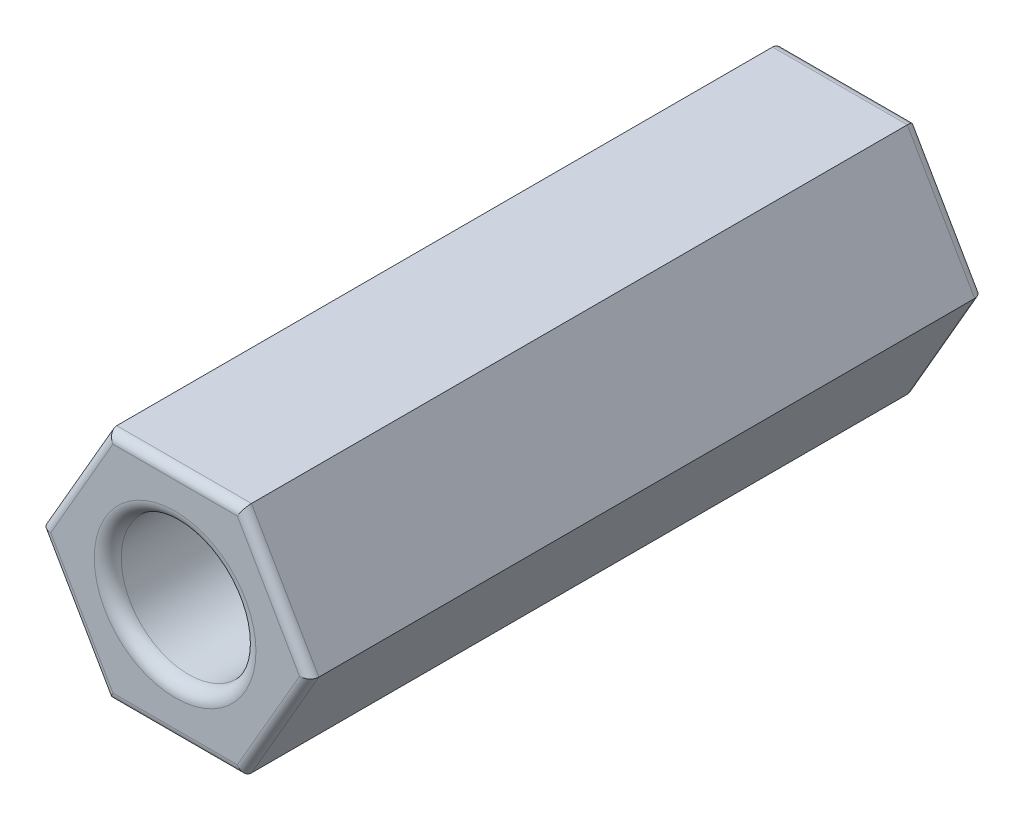
ISO-10303-21;
HEADER;
FILE_DESCRIPTION(('STEP AP214'),'2;1');
FILE_NAME('part.step','',(''),(''),'','','');
FILE_SCHEMA(('AUTOMOTIVE_DESIGN { 1 0 10303 214 1 1 1 1 }'));
ENDSEC;
DATA;
#1=APPLICATION_CONTEXT('core data for automotive mechanical design processes');
#2=APPLICATION_PROTOCOL_DEFINITION('international standard','automotive_design',2000,#1);
#3=PRODUCT_CONTEXT('',#1,'mechanical');
#4=PRODUCT('Part','Part','',(#3));
#5=PRODUCT_RELATED_PRODUCT_CATEGORY('part','',(#4));
#6=PRODUCT_DEFINITION_FORMATION('','',#4);
#7=PRODUCT_DEFINITION_CONTEXT('part definition',#1,'design');
#8=PRODUCT_DEFINITION('design','',#6,#7);
#9=PRODUCT_DEFINITION_SHAPE('','',#8);
#10=(LENGTH_UNIT() NAMED_UNIT(*) SI_UNIT(.MILLI.,.METRE.));
#11=(NAMED_UNIT(*) PLANE_ANGLE_UNIT() SI_UNIT($,.RADIAN.));
#12=(NAMED_UNIT(*) SI_UNIT($,.STERADIAN.) SOLID_ANGLE_UNIT());
#13=UNCERTAINTY_MEASURE_WITH_UNIT(LENGTH_MEASURE(1.E-05),#10,'distance_accuracy_value','');
#14=(GEOMETRIC_REPRESENTATION_CONTEXT(3) GLOBAL_UNCERTAINTY_ASSIGNED_CONTEXT((#13)) GLOBAL_UNIT_ASSIGNED_CONTEXT((#10,
#11,#12)) REPRESENTATION_CONTEXT('',''));
#15=CARTESIAN_POINT('',(0.,0.,0.));
#16=DIRECTION('',(0.,0.,1.));
#17=DIRECTION('',(1.,0.,0.));
#18=AXIS2_PLACEMENT_3D('',#15,#16,#17);
#19=CARTESIAN_POINT('',(0.,0.,15.));
#20=DIRECTION('',(0.,0.,1.));
#21=DIRECTION('',(1.,0.,0.));
#22=AXIS2_PLACEMENT_3D('',#19,#20,#21);
#23=PLANE('',#22);
#24=DIRECTION('',(-1.,0.,0.));
#25=VECTOR('',#24,1.);
#26=CARTESIAN_POINT('',(-1.50000000000001,2.39807621135331,15.));
#27=LINE('',#26,#25);
#28=CARTESIAN_POINT('',(1.38452994616207,2.39807621135332,15.));
#29=VERTEX_POINT('',#28);
#30=CARTESIAN_POINT('',(-1.38452994616209,2.39807621135331,15.));
#31=VERTEX_POINT('',#30);
#32=EDGE_CURVE('E127',#29,#31,#27,.T.);
#33=ORIENTED_EDGE('',*,*,#32,.T.);
#34=DIRECTION('',(-0.499999999999995,-0.866025403784442,0.));
#35=VECTOR('',#34,1.);
#36=CARTESIAN_POINT('',(-2.82679491924311,-0.10000000000002,15.));
#37=LINE('',#36,#35);
#38=CARTESIAN_POINT('',(-2.76905989232415,0.,15.));
#39=VERTEX_POINT('',#38);
#40=EDGE_CURVE('E160',#31,#39,#37,.T.);
#41=ORIENTED_EDGE('',*,*,#40,.T.);
#42=DIRECTION('',(0.500000000000007,-0.866025403784435,0.));
#43=VECTOR('',#42,1.);
#44=CARTESIAN_POINT('',(-1.32679491924309,-2.49807621135333,15.));
#45=LINE('',#44,#43);
#46=CARTESIAN_POINT('',(-1.38452994616205,-2.39807621135333,15.));
#47=VERTEX_POINT('',#46);
#48=EDGE_CURVE('E158',#39,#47,#45,.T.);
#49=ORIENTED_EDGE('',*,*,#48,.T.);
#50=DIRECTION('',(1.,0.,0.));
#51=VECTOR('',#50,1.);
#52=CARTESIAN_POINT('',(1.50000000000003,-2.3980762113533,15.));
#53=LINE('',#52,#51);
#54=CARTESIAN_POINT('',(1.3845299461621,-2.3980762113533,15.));
#55=VERTEX_POINT('',#54);
#56=EDGE_CURVE('E156',#47,#55,#53,.T.);
#57=ORIENTED_EDGE('',*,*,#56,.T.);
#58=DIRECTION('',(0.499999999999995,0.866025403784442,0.));
#59=VECTOR('',#58,1.);
#60=CARTESIAN_POINT('',(2.82679491924311,0.0999999999999994,15.));
#61=LINE('',#60,#59);
#62=CARTESIAN_POINT('',(2.76905989232415,0.,15.));
#63=VERTEX_POINT('',#62);
#64=EDGE_CURVE('E130',#55,#63,#61,.T.);
#65=ORIENTED_EDGE('',*,*,#64,.T.);
#66=DIRECTION('',(-0.500000000000001,0.866025403784438,0.));
#67=VECTOR('',#66,1.);
#68=CARTESIAN_POINT('',(1.32679491924311,2.49807621135332,15.));
#69=LINE('',#68,#67);
#70=EDGE_CURVE('E122',#63,#29,#69,.T.);
#71=ORIENTED_EDGE('',*,*,#70,.T.);
#72=EDGE_LOOP('',(#33,#41,#49,#57,#65,#71));
#73=FACE_BOUND('',#72,.T.);
#74=CARTESIAN_POINT('',(0.,0.,15.));
#75=DIRECTION('',(0.,0.,1.));
#76=DIRECTION('',(1.,0.,0.));
#77=AXIS2_PLACEMENT_3D('',#74,#75,#76);
#78=CIRCLE('',#77,1.8);
#79=CARTESIAN_POINT('',(1.8,0.,15.));
#80=VERTEX_POINT('',#79);
#81=EDGE_CURVE('E148',#80,#80,#78,.F.);
#82=ORIENTED_EDGE('',*,*,#81,.T.);
#83=EDGE_LOOP('',(#82));
#84=FACE_BOUND('',#83,.T.);
#85=ADVANCED_FACE('F32',(#73,#84),#23,.T.);
#86=CARTESIAN_POINT('',(0.,0.,0.));
#87=DIRECTION('',(0.,0.,1.));
#88=DIRECTION('',(1.,0.,0.));
#89=AXIS2_PLACEMENT_3D('',#86,#87,#88);
#90=PLANE('',#89);
#91=DIRECTION('',(-0.500000000000001,0.866025403784438,0.));
#92=VECTOR('',#91,1.);
#93=CARTESIAN_POINT('',(2.07679491924311,1.19903810567666,0.));
#94=LINE('',#93,#92);
#95=CARTESIAN_POINT('',(1.38452994616207,2.39807621135332,0.));
#96=VERTEX_POINT('',#95);
#97=CARTESIAN_POINT('',(2.76905989232415,0.,0.));
#98=VERTEX_POINT('',#97);
#99=EDGE_CURVE('E187',#96,#98,#94,.F.);
#100=ORIENTED_EDGE('',*,*,#99,.T.);
#101=DIRECTION('',(0.499999999999995,0.866025403784442,0.));
#102=VECTOR('',#101,1.);
#103=CARTESIAN_POINT('',(2.07679491924313,-1.19903810567665,0.));
#104=LINE('',#103,#102);
#105=CARTESIAN_POINT('',(1.3845299461621,-2.3980762113533,0.));
#106=VERTEX_POINT('',#105);
#107=EDGE_CURVE('E11',#98,#106,#104,.F.);
#108=ORIENTED_EDGE('',*,*,#107,.T.);
#109=DIRECTION('',(1.,0.,0.));
#110=VECTOR('',#109,1.);
#111=CARTESIAN_POINT('',(0.,-2.39807621135331,0.));
#112=LINE('',#111,#110);
#113=CARTESIAN_POINT('',(-1.38452994616205,-2.39807621135333,0.));
#114=VERTEX_POINT('',#113);
#115=EDGE_CURVE('E41',#106,#114,#112,.F.);
#116=ORIENTED_EDGE('',*,*,#115,.T.);
#117=DIRECTION('',(0.500000000000007,-0.866025403784435,0.));
#118=VECTOR('',#117,1.);
#119=CARTESIAN_POINT('',(-2.0767949192431,-1.19903810567667,0.));
#120=LINE('',#119,#118);
#121=CARTESIAN_POINT('',(-2.76905989232415,0.,0.));
#122=VERTEX_POINT('',#121);
#123=EDGE_CURVE('E193',#114,#122,#120,.F.);
#124=ORIENTED_EDGE('',*,*,#123,.T.);
#125=DIRECTION('',(-0.499999999999995,-0.866025403784442,0.));
#126=VECTOR('',#125,1.);
#127=CARTESIAN_POINT('',(-2.07679491924312,1.19903810567665,0.));
#128=LINE('',#127,#126);
#129=CARTESIAN_POINT('',(-1.38452994616209,2.39807621135331,0.));
#130=VERTEX_POINT('',#129);
#131=EDGE_CURVE('E191',#122,#130,#128,.F.);
#132=ORIENTED_EDGE('',*,*,#131,.T.);
#133=DIRECTION('',(-1.,0.,0.));
#134=VECTOR('',#133,1.);
#135=CARTESIAN_POINT('',(0.,2.39807621135331,0.));
#136=LINE('',#135,#134);
#137=EDGE_CURVE('E189',#130,#96,#136,.F.);
#138=ORIENTED_EDGE('',*,*,#137,.T.);
#139=EDGE_LOOP('',(#100,#108,#116,#124,#132,#138));
#140=FACE_BOUND('',#139,.T.);
#141=CARTESIAN_POINT('',(0.,0.,0.));
#142=DIRECTION('',(0.,0.,1.));
#143=DIRECTION('',(1.,0.,0.));
#144=AXIS2_PLACEMENT_3D('',#141,#142,#143);
#145=CIRCLE('',#144,1.8);
#146=CARTESIAN_POINT('',(1.8,0.,0.));
#147=VERTEX_POINT('',#146);
#148=EDGE_CURVE('E251',#147,#147,#145,.T.);
#149=ORIENTED_EDGE('',*,*,#148,.T.);
#150=EDGE_LOOP('',(#149));
#151=FACE_BOUND('',#150,.T.);
#152=ADVANCED_FACE('F229',(#140,#151),#90,.F.);
#153=CARTESIAN_POINT('',(1.50000000000003,-2.5980762113533,15.));
#154=DIRECTION('',(-0.866025403784441,0.499999999999995,0.));
#155=DIRECTION('',(-0.499999999999995,-0.866025403784442,0.));
#156=AXIS2_PLACEMENT_3D('',#153,#154,#155);
#157=PLANE('',#156);
#158=DIRECTION('',(0.,0.,-1.));
#159=VECTOR('',#158,1.);
#160=CARTESIAN_POINT('',(3.,0.,15.));
#161=LINE('',#160,#159);
#162=CARTESIAN_POINT('',(3.,0.,14.8));
#163=VERTEX_POINT('',#162);
#164=CARTESIAN_POINT('',(3.,0.,0.200000000000001));
#165=VERTEX_POINT('',#164);
#166=EDGE_CURVE('E244',#163,#165,#161,.T.);
#167=ORIENTED_EDGE('',*,*,#166,.F.);
#168=DIRECTION('',(0.499999999999995,0.866025403784442,0.));
#169=VECTOR('',#168,1.);
#170=CARTESIAN_POINT('',(1.50000000000003,-2.5980762113533,14.8));
#171=LINE('',#170,#169);
#172=CARTESIAN_POINT('',(1.50000000000003,-2.5980762113533,14.8));
#173=VERTEX_POINT('',#172);
#174=EDGE_CURVE('E178',#163,#173,#171,.F.);
#175=ORIENTED_EDGE('',*,*,#174,.T.);
#176=DIRECTION('',(0.,0.,-1.));
#177=VECTOR('',#176,1.);
#178=CARTESIAN_POINT('',(1.50000000000003,-2.5980762113533,15.));
#179=LINE('',#178,#177);
#180=CARTESIAN_POINT('',(1.50000000000003,-2.5980762113533,0.200000000000001));
#181=VERTEX_POINT('',#180);
#182=EDGE_CURVE('E205',#173,#181,#179,.T.);
#183=ORIENTED_EDGE('',*,*,#182,.T.);
#184=DIRECTION('',(0.499999999999995,0.866025403784442,0.));
#185=VECTOR('',#184,1.);
#186=CARTESIAN_POINT('',(1.50000000000003,-2.5980762113533,0.200000000000001));
#187=LINE('',#186,#185);
#188=EDGE_CURVE('E175',#181,#165,#187,.T.);
#189=ORIENTED_EDGE('',*,*,#188,.T.);
#190=EDGE_LOOP('',(#167,#175,#183,#189));
#191=FACE_BOUND('',#190,.T.);
#192=ADVANCED_FACE('F243',(#191),#157,.F.);
#193=CARTESIAN_POINT('',(3.,0.,15.));
#194=DIRECTION('',(-0.866025403784438,-0.500000000000001,0.));
#195=DIRECTION('',(0.500000000000001,-0.866025403784438,0.));
#196=AXIS2_PLACEMENT_3D('',#193,#194,#195);
#197=PLANE('',#196);
#198=DIRECTION('',(0.,0.,-1.));
#199=VECTOR('',#198,1.);
#200=CARTESIAN_POINT('',(1.49999999999999,2.59807621135332,15.));
#201=LINE('',#200,#199);
#202=CARTESIAN_POINT('',(1.49999999999999,2.59807621135332,14.8));
#203=VERTEX_POINT('',#202);
#204=CARTESIAN_POINT('',(1.49999999999999,2.59807621135332,0.200000000000001));
#205=VERTEX_POINT('',#204);
#206=EDGE_CURVE('E252',#203,#205,#201,.T.);
#207=ORIENTED_EDGE('',*,*,#206,.F.);
#208=DIRECTION('',(-0.500000000000001,0.866025403784438,0.));
#209=VECTOR('',#208,1.);
#210=CARTESIAN_POINT('',(3.,0.,14.8));
#211=LINE('',#210,#209);
#212=EDGE_CURVE('E139',#203,#163,#211,.F.);
#213=ORIENTED_EDGE('',*,*,#212,.T.);
#214=ORIENTED_EDGE('',*,*,#166,.T.);
#215=DIRECTION('',(-0.500000000000001,0.866025403784438,0.));
#216=VECTOR('',#215,1.);
#217=CARTESIAN_POINT('',(3.,0.,0.200000000000001));
#218=LINE('',#217,#216);
#219=EDGE_CURVE('E180',#165,#205,#218,.T.);
#220=ORIENTED_EDGE('',*,*,#219,.T.);
#221=EDGE_LOOP('',(#207,#213,#214,#220));
#222=FACE_BOUND('',#221,.T.);
#223=ADVANCED_FACE('F249',(#222),#197,.F.);
#224=CARTESIAN_POINT('',(1.49999999999999,2.59807621135332,15.));
#225=DIRECTION('',(0.,-1.,0.));
#226=DIRECTION('',(1.,0.,0.));
#227=AXIS2_PLACEMENT_3D('',#224,#225,#226);
#228=PLANE('',#227);
#229=DIRECTION('',(0.,0.,-1.));
#230=VECTOR('',#229,1.);
#231=CARTESIAN_POINT('',(-1.50000000000001,2.59807621135331,15.));
#232=LINE('',#231,#230);
#233=CARTESIAN_POINT('',(-1.50000000000001,2.59807621135331,14.8));
#234=VERTEX_POINT('',#233);
#235=CARTESIAN_POINT('',(-1.50000000000001,2.59807621135331,0.200000000000001));
#236=VERTEX_POINT('',#235);
#237=EDGE_CURVE('E257',#234,#236,#232,.T.);
#238=ORIENTED_EDGE('',*,*,#237,.F.);
#239=DIRECTION('',(-1.,0.,0.));
#240=VECTOR('',#239,1.);
#241=CARTESIAN_POINT('',(1.49999999999999,2.59807621135332,14.8));
#242=LINE('',#241,#240);
#243=EDGE_CURVE('E185',#234,#203,#242,.F.);
#244=ORIENTED_EDGE('',*,*,#243,.T.);
#245=ORIENTED_EDGE('',*,*,#206,.T.);
#246=DIRECTION('',(-1.,0.,0.));
#247=VECTOR('',#246,1.);
#248=CARTESIAN_POINT('',(1.49999999999999,2.59807621135332,0.200000000000001));
#249=LINE('',#248,#247);
#250=EDGE_CURVE('E183',#205,#236,#249,.T.);
#251=ORIENTED_EDGE('',*,*,#250,.T.);
#252=EDGE_LOOP('',(#238,#244,#245,#251));
#253=FACE_BOUND('',#252,.T.);
#254=ADVANCED_FACE('F295',(#253),#228,.F.);
#255=CARTESIAN_POINT('',(-1.50000000000001,2.59807621135331,15.));
#256=DIRECTION('',(0.866025403784441,-0.499999999999995,0.));
#257=DIRECTION('',(0.499999999999995,0.866025403784442,0.));
#258=AXIS2_PLACEMENT_3D('',#255,#256,#257);
#259=PLANE('',#258);
#260=DIRECTION('',(0.,0.,-1.));
#261=VECTOR('',#260,1.);
#262=CARTESIAN_POINT('',(-3.,0.,15.));
#263=LINE('',#262,#261);
#264=CARTESIAN_POINT('',(-3.,0.,14.8));
#265=VERTEX_POINT('',#264);
#266=CARTESIAN_POINT('',(-3.,0.,0.200000000000001));
#267=VERTEX_POINT('',#266);
#268=EDGE_CURVE('E480',#265,#267,#263,.T.);
#269=ORIENTED_EDGE('',*,*,#268,.F.);
#270=DIRECTION('',(-0.499999999999995,-0.866025403784442,0.));
#271=VECTOR('',#270,1.);
#272=CARTESIAN_POINT('',(-1.50000000000001,2.59807621135331,14.8));
#273=LINE('',#272,#271);
#274=EDGE_CURVE('E164',#265,#234,#273,.F.);
#275=ORIENTED_EDGE('',*,*,#274,.T.);
#276=ORIENTED_EDGE('',*,*,#237,.T.);
#277=DIRECTION('',(-0.499999999999995,-0.866025403784442,0.));
#278=VECTOR('',#277,1.);
#279=CARTESIAN_POINT('',(-1.50000000000001,2.59807621135331,0.200000000000001));
#280=LINE('',#279,#278);
#281=EDGE_CURVE('E162',#236,#267,#280,.T.);
#282=ORIENTED_EDGE('',*,*,#281,.T.);
#283=EDGE_LOOP('',(#269,#275,#276,#282));
#284=FACE_BOUND('',#283,.T.);
#285=ADVANCED_FACE('F291',(#284),#259,.F.);
#286=CARTESIAN_POINT('',(-3.,0.,15.));
#287=DIRECTION('',(0.866025403784435,0.500000000000007,0.));
#288=DIRECTION('',(-0.500000000000007,0.866025403784435,0.));
#289=AXIS2_PLACEMENT_3D('',#286,#287,#288);
#290=PLANE('',#289);
#291=DIRECTION('',(0.,0.,-1.));
#292=VECTOR('',#291,1.);
#293=CARTESIAN_POINT('',(-1.49999999999998,-2.59807621135333,15.));
#294=LINE('',#293,#292);
#295=CARTESIAN_POINT('',(-1.49999999999998,-2.59807621135333,14.8));
#296=VERTEX_POINT('',#295);
#297=CARTESIAN_POINT('',(-1.49999999999998,-2.59807621135333,0.200000000000001));
#298=VERTEX_POINT('',#297);
#299=EDGE_CURVE('E477',#296,#298,#294,.T.);
#300=ORIENTED_EDGE('',*,*,#299,.F.);
#301=DIRECTION('',(0.500000000000007,-0.866025403784435,0.));
#302=VECTOR('',#301,1.);
#303=CARTESIAN_POINT('',(-3.,0.,14.8));
#304=LINE('',#303,#302);
#305=EDGE_CURVE('E169',#296,#265,#304,.F.);
#306=ORIENTED_EDGE('',*,*,#305,.T.);
#307=ORIENTED_EDGE('',*,*,#268,.T.);
#308=DIRECTION('',(0.500000000000007,-0.866025403784435,0.));
#309=VECTOR('',#308,1.);
#310=CARTESIAN_POINT('',(-3.,0.,0.200000000000001));
#311=LINE('',#310,#309);
#312=EDGE_CURVE('E167',#267,#298,#311,.T.);
#313=ORIENTED_EDGE('',*,*,#312,.T.);
#314=EDGE_LOOP('',(#300,#306,#307,#313));
#315=FACE_BOUND('',#314,.T.);
#316=ADVANCED_FACE('F287',(#315),#290,.F.);
#317=CARTESIAN_POINT('',(-1.49999999999998,-2.59807621135333,15.));
#318=DIRECTION('',(0.,1.,0.));
#319=DIRECTION('',(-1.,0.,0.));
#320=AXIS2_PLACEMENT_3D('',#317,#318,#319);
#321=PLANE('',#320);
#322=ORIENTED_EDGE('',*,*,#182,.F.);
#323=DIRECTION('',(1.,0.,0.));
#324=VECTOR('',#323,1.);
#325=CARTESIAN_POINT('',(-1.49999999999998,-2.59807621135333,14.8));
#326=LINE('',#325,#324);
#327=EDGE_CURVE('E173',#173,#296,#326,.F.);
#328=ORIENTED_EDGE('',*,*,#327,.T.);
#329=ORIENTED_EDGE('',*,*,#299,.T.);
#330=DIRECTION('',(1.,0.,0.));
#331=VECTOR('',#330,1.);
#332=CARTESIAN_POINT('',(-1.49999999999998,-2.59807621135333,0.200000000000001));
#333=LINE('',#332,#331);
#334=EDGE_CURVE('E171',#298,#181,#333,.T.);
#335=ORIENTED_EDGE('',*,*,#334,.T.);
#336=EDGE_LOOP('',(#322,#328,#329,#335));
#337=FACE_BOUND('',#336,.T.);
#338=ADVANCED_FACE('F284',(#337),#321,.F.);
#339=CARTESIAN_POINT('',(0.,0.,15.));
#340=DIRECTION('',(0.,0.,-1.));
#341=DIRECTION('',(-1.,0.,0.));
#342=AXIS2_PLACEMENT_3D('',#339,#340,#341);
#343=CYLINDRICAL_SURFACE('',#342,1.5);
#344=CARTESIAN_POINT('',(0.,0.,0.3));
#345=DIRECTION('',(0.,0.,1.));
#346=DIRECTION('',(1.,0.,0.));
#347=AXIS2_PLACEMENT_3D('',#344,#345,#346);
#348=CIRCLE('',#347,1.5);
#349=CARTESIAN_POINT('',(1.5,0.,0.3));
#350=VERTEX_POINT('',#349);
#351=EDGE_CURVE('E151',#350,#350,#348,.F.);
#352=ORIENTED_EDGE('',*,*,#351,.T.);
#353=EDGE_LOOP('',(#352));
#354=FACE_BOUND('',#353,.T.);
#355=CARTESIAN_POINT('',(0.,0.,14.7));
#356=DIRECTION('',(0.,0.,1.));
#357=DIRECTION('',(1.,0.,0.));
#358=AXIS2_PLACEMENT_3D('',#355,#356,#357);
#359=CIRCLE('',#358,1.5);
#360=CARTESIAN_POINT('',(1.5,0.,14.7));
#361=VERTEX_POINT('',#360);
#362=EDGE_CURVE('E255',#361,#361,#359,.T.);
#363=ORIENTED_EDGE('',*,*,#362,.T.);
#364=EDGE_LOOP('',(#363));
#365=FACE_BOUND('',#364,.T.);
#366=ADVANCED_FACE('F265',(#354,#365),#343,.F.);
#367=CARTESIAN_POINT('',(0.,0.,0.3));
#368=DIRECTION('',(0.,0.,1.));
#369=DIRECTION('',(1.,0.,0.));
#370=AXIS2_PLACEMENT_3D('',#367,#368,#369);
#371=TOROIDAL_SURFACE('',#370,1.8,0.3);
#372=ORIENTED_EDGE('',*,*,#351,.F.);
#373=EDGE_LOOP('',(#372));
#374=FACE_BOUND('',#373,.T.);
#375=ORIENTED_EDGE('',*,*,#148,.F.);
#376=EDGE_LOOP('',(#375));
#377=FACE_BOUND('',#376,.T.);
#378=ADVANCED_FACE('F268',(#374,#377),#371,.T.);
#379=CARTESIAN_POINT('',(0.,0.,14.7));
#380=DIRECTION('',(0.,0.,1.));
#381=DIRECTION('',(1.,0.,0.));
#382=AXIS2_PLACEMENT_3D('',#379,#380,#381);
#383=TOROIDAL_SURFACE('',#382,1.8,0.3);
#384=ORIENTED_EDGE('',*,*,#81,.F.);
#385=EDGE_LOOP('',(#384));
#386=FACE_BOUND('',#385,.T.);
#387=ORIENTED_EDGE('',*,*,#362,.F.);
#388=EDGE_LOOP('',(#387));
#389=FACE_BOUND('',#388,.T.);
#390=ADVANCED_FACE('F271',(#386,#389),#383,.T.);
#391=CARTESIAN_POINT('',(2.07679491924313,-1.19903810567665,14.8));
#392=DIRECTION('',(-0.499999999999995,-0.866025403784442,0.));
#393=DIRECTION('',(0.866025403784441,-0.499999999999995,0.));
#394=AXIS2_PLACEMENT_3D('',#391,#392,#393);
#395=CYLINDRICAL_SURFACE('',#394,0.2);
#396=CARTESIAN_POINT('',(1.3845299461621,-2.3980762113533,14.8));
#397=DIRECTION('',(-0.866025403784435,-0.500000000000007,0.));
#398=DIRECTION('',(0.500000000000007,-0.866025403784435,0.));
#399=AXIS2_PLACEMENT_3D('',#396,#397,#398);
#400=ELLIPSE('',#399,0.23094010767585,0.2);
#401=EDGE_CURVE('E142',#173,#55,#400,.T.);
#402=ORIENTED_EDGE('',*,*,#401,.F.);
#403=ORIENTED_EDGE('',*,*,#174,.F.);
#404=CARTESIAN_POINT('',(2.76905989232415,0.,14.8));
#405=DIRECTION('',(0.,-1.,0.));
#406=DIRECTION('',(1.,0.,0.));
#407=AXIS2_PLACEMENT_3D('',#404,#405,#406);
#408=ELLIPSE('',#407,0.23094010767585,0.2);
#409=EDGE_CURVE('E203',#63,#163,#408,.F.);
#410=ORIENTED_EDGE('',*,*,#409,.F.);
#411=ORIENTED_EDGE('',*,*,#64,.F.);
#412=EDGE_LOOP('',(#402,#403,#410,#411));
#413=FACE_BOUND('',#412,.T.);
#414=ADVANCED_FACE('F304',(#413),#395,.T.);
#415=CARTESIAN_POINT('',(2.07679491924311,1.19903810567666,14.8));
#416=DIRECTION('',(0.500000000000001,-0.866025403784438,0.));
#417=DIRECTION('',(0.866025403784438,0.500000000000001,0.));
#418=AXIS2_PLACEMENT_3D('',#415,#416,#417);
#419=CYLINDRICAL_SURFACE('',#418,0.2);
#420=ORIENTED_EDGE('',*,*,#409,.T.);
#421=ORIENTED_EDGE('',*,*,#212,.F.);
#422=CARTESIAN_POINT('',(1.38452994616207,2.39807621135332,14.8));
#423=DIRECTION('',(0.86602540378444,-0.499999999999998,0.));
#424=DIRECTION('',(0.499999999999998,0.86602540378444,0.));
#425=AXIS2_PLACEMENT_3D('',#422,#423,#424);
#426=ELLIPSE('',#425,0.23094010767585,0.2);
#427=EDGE_CURVE('E137',#29,#203,#426,.F.);
#428=ORIENTED_EDGE('',*,*,#427,.F.);
#429=ORIENTED_EDGE('',*,*,#70,.F.);
#430=EDGE_LOOP('',(#420,#421,#428,#429));
#431=FACE_BOUND('',#430,.T.);
#432=ADVANCED_FACE('F138',(#431),#419,.T.);
#433=CARTESIAN_POINT('',(0.,-2.39807621135331,14.8));
#434=DIRECTION('',(-1.,0.,0.));
#435=DIRECTION('',(0.,-1.,0.));
#436=AXIS2_PLACEMENT_3D('',#433,#434,#435);
#437=CYLINDRICAL_SURFACE('',#436,0.2);
#438=ORIENTED_EDGE('',*,*,#401,.T.);
#439=ORIENTED_EDGE('',*,*,#56,.F.);
#440=CARTESIAN_POINT('',(-1.38452994616205,-2.39807621135333,14.8));
#441=DIRECTION('',(-0.866025403784443,0.499999999999992,0.));
#442=DIRECTION('',(-0.499999999999992,-0.866025403784443,0.));
#443=AXIS2_PLACEMENT_3D('',#440,#441,#442);
#444=ELLIPSE('',#443,0.23094010767585,0.2);
#445=EDGE_CURVE('E143',#296,#47,#444,.T.);
#446=ORIENTED_EDGE('',*,*,#445,.F.);
#447=ORIENTED_EDGE('',*,*,#327,.F.);
#448=EDGE_LOOP('',(#438,#439,#446,#447));
#449=FACE_BOUND('',#448,.T.);
#450=ADVANCED_FACE('F316',(#449),#437,.T.);
#451=CARTESIAN_POINT('',(0.,2.39807621135331,14.8));
#452=DIRECTION('',(1.,0.,0.));
#453=DIRECTION('',(0.,1.,0.));
#454=AXIS2_PLACEMENT_3D('',#451,#452,#453);
#455=CYLINDRICAL_SURFACE('',#454,0.2);
#456=ORIENTED_EDGE('',*,*,#427,.T.);
#457=ORIENTED_EDGE('',*,*,#243,.F.);
#458=CARTESIAN_POINT('',(-1.38452994616209,2.39807621135331,14.8));
#459=DIRECTION('',(0.866025403784436,0.500000000000004,0.));
#460=DIRECTION('',(0.500000000000004,-0.866025403784436,0.));
#461=AXIS2_PLACEMENT_3D('',#458,#459,#460);
#462=ELLIPSE('',#461,0.23094010767585,0.2);
#463=EDGE_CURVE('E146',#31,#234,#462,.F.);
#464=ORIENTED_EDGE('',*,*,#463,.F.);
#465=ORIENTED_EDGE('',*,*,#32,.F.);
#466=EDGE_LOOP('',(#456,#457,#464,#465));
#467=FACE_BOUND('',#466,.T.);
#468=ADVANCED_FACE('F145',(#467),#455,.T.);
#469=CARTESIAN_POINT('',(-2.0767949192431,-1.19903810567667,14.8));
#470=DIRECTION('',(-0.500000000000007,0.866025403784435,0.));
#471=DIRECTION('',(-0.866025403784435,-0.500000000000007,0.));
#472=AXIS2_PLACEMENT_3D('',#469,#470,#471);
#473=CYLINDRICAL_SURFACE('',#472,0.2);
#474=ORIENTED_EDGE('',*,*,#445,.T.);
#475=ORIENTED_EDGE('',*,*,#48,.F.);
#476=CARTESIAN_POINT('',(-2.76905989232415,0.,14.8));
#477=DIRECTION('',(0.,1.,0.));
#478=DIRECTION('',(-1.,0.,0.));
#479=AXIS2_PLACEMENT_3D('',#476,#477,#478);
#480=ELLIPSE('',#479,0.23094010767585,0.2);
#481=EDGE_CURVE('E196',#265,#39,#480,.T.);
#482=ORIENTED_EDGE('',*,*,#481,.F.);
#483=ORIENTED_EDGE('',*,*,#305,.F.);
#484=EDGE_LOOP('',(#474,#475,#482,#483));
#485=FACE_BOUND('',#484,.T.);
#486=ADVANCED_FACE('F309',(#485),#473,.T.);
#487=CARTESIAN_POINT('',(-2.07679491924312,1.19903810567665,14.8));
#488=DIRECTION('',(0.499999999999995,0.866025403784442,0.));
#489=DIRECTION('',(-0.866025403784441,0.499999999999995,0.));
#490=AXIS2_PLACEMENT_3D('',#487,#488,#489);
#491=CYLINDRICAL_SURFACE('',#490,0.2);
#492=ORIENTED_EDGE('',*,*,#463,.T.);
#493=ORIENTED_EDGE('',*,*,#274,.F.);
#494=ORIENTED_EDGE('',*,*,#481,.T.);
#495=ORIENTED_EDGE('',*,*,#40,.F.);
#496=EDGE_LOOP('',(#492,#493,#494,#495));
#497=FACE_BOUND('',#496,.T.);
#498=ADVANCED_FACE('F306',(#497),#491,.T.);
#499=CARTESIAN_POINT('',(-1.32679491924312,2.49807621135331,0.200000000000001));
#500=DIRECTION('',(-0.499999999999995,-0.866025403784442,0.));
#501=DIRECTION('',(0.866025403784441,-0.499999999999995,0.));
#502=AXIS2_PLACEMENT_3D('',#499,#500,#501);
#503=CYLINDRICAL_SURFACE('',#502,0.2);
#504=CARTESIAN_POINT('',(-1.38452994616209,2.39807621135331,0.200000000000001));
#505=DIRECTION('',(-0.866025403784436,-0.500000000000004,0.));
#506=DIRECTION('',(-0.500000000000004,0.866025403784436,0.));
#507=AXIS2_PLACEMENT_3D('',#504,#505,#506);
#508=ELLIPSE('',#507,0.23094010767585,0.2);
#509=EDGE_CURVE('E214',#130,#236,#508,.F.);
#510=ORIENTED_EDGE('',*,*,#509,.F.);
#511=ORIENTED_EDGE('',*,*,#131,.F.);
#512=CARTESIAN_POINT('',(-2.76905989232415,0.,0.200000000000001));
#513=DIRECTION('',(0.,-1.,0.));
#514=DIRECTION('',(-1.,0.,0.));
#515=AXIS2_PLACEMENT_3D('',#512,#513,#514);
#516=ELLIPSE('',#515,0.23094010767585,0.2);
#517=EDGE_CURVE('E36',#267,#122,#516,.T.);
#518=ORIENTED_EDGE('',*,*,#517,.F.);
#519=ORIENTED_EDGE('',*,*,#281,.F.);
#520=EDGE_LOOP('',(#510,#511,#518,#519));
#521=FACE_BOUND('',#520,.T.);
#522=ADVANCED_FACE('F34',(#521),#503,.T.);
#523=CARTESIAN_POINT('',(-2.82679491924311,0.0999999999999805,0.200000000000001));
#524=DIRECTION('',(0.500000000000007,-0.866025403784435,0.));
#525=DIRECTION('',(0.866025403784435,0.500000000000007,0.));
#526=AXIS2_PLACEMENT_3D('',#523,#524,#525);
#527=CYLINDRICAL_SURFACE('',#526,0.2);
#528=ORIENTED_EDGE('',*,*,#517,.T.);
#529=ORIENTED_EDGE('',*,*,#123,.F.);
#530=CARTESIAN_POINT('',(-1.38452994616205,-2.39807621135333,0.200000000000001));
#531=DIRECTION('',(0.866025403784443,-0.499999999999992,0.));
#532=DIRECTION('',(-0.499999999999992,-0.866025403784443,0.));
#533=AXIS2_PLACEMENT_3D('',#530,#531,#532);
#534=ELLIPSE('',#533,0.23094010767585,0.2);
#535=EDGE_CURVE('E212',#298,#114,#534,.T.);
#536=ORIENTED_EDGE('',*,*,#535,.F.);
#537=ORIENTED_EDGE('',*,*,#312,.F.);
#538=EDGE_LOOP('',(#528,#529,#536,#537));
#539=FACE_BOUND('',#538,.T.);
#540=ADVANCED_FACE('F224',(#539),#527,.T.);
#541=CARTESIAN_POINT('',(1.49999999999999,2.39807621135332,0.200000000000001));
#542=DIRECTION('',(-1.,0.,0.));
#543=DIRECTION('',(0.,-1.,0.));
#544=AXIS2_PLACEMENT_3D('',#541,#542,#543);
#545=CYLINDRICAL_SURFACE('',#544,0.2);
#546=ORIENTED_EDGE('',*,*,#509,.T.);
#547=ORIENTED_EDGE('',*,*,#250,.F.);
#548=CARTESIAN_POINT('',(1.38452994616207,2.39807621135332,0.200000000000001));
#549=DIRECTION('',(-0.86602540378444,0.499999999999998,0.));
#550=DIRECTION('',(0.499999999999998,0.86602540378444,0.));
#551=AXIS2_PLACEMENT_3D('',#548,#549,#550);
#552=ELLIPSE('',#551,0.23094010767585,0.2);
#553=EDGE_CURVE('E209',#96,#205,#552,.F.);
#554=ORIENTED_EDGE('',*,*,#553,.F.);
#555=ORIENTED_EDGE('',*,*,#137,.F.);
#556=EDGE_LOOP('',(#546,#547,#554,#555));
#557=FACE_BOUND('',#556,.T.);
#558=ADVANCED_FACE('F233',(#557),#545,.T.);
#559=CARTESIAN_POINT('',(-1.49999999999998,-2.39807621135333,0.200000000000001));
#560=DIRECTION('',(1.,0.,0.));
#561=DIRECTION('',(0.,1.,0.));
#562=AXIS2_PLACEMENT_3D('',#559,#560,#561);
#563=CYLINDRICAL_SURFACE('',#562,0.2);
#564=ORIENTED_EDGE('',*,*,#535,.T.);
#565=ORIENTED_EDGE('',*,*,#115,.F.);
#566=CARTESIAN_POINT('',(1.3845299461621,-2.3980762113533,0.200000000000001));
#567=DIRECTION('',(0.866025403784435,0.500000000000007,0.));
#568=DIRECTION('',(0.500000000000007,-0.866025403784435,0.));
#569=AXIS2_PLACEMENT_3D('',#566,#567,#568);
#570=ELLIPSE('',#569,0.23094010767585,0.2);
#571=EDGE_CURVE('E49',#181,#106,#570,.T.);
#572=ORIENTED_EDGE('',*,*,#571,.F.);
#573=ORIENTED_EDGE('',*,*,#334,.F.);
#574=EDGE_LOOP('',(#564,#565,#572,#573));
#575=FACE_BOUND('',#574,.T.);
#576=ADVANCED_FACE('F329',(#575),#563,.T.);
#577=CARTESIAN_POINT('',(2.82679491924311,-0.1,0.200000000000001));
#578=DIRECTION('',(-0.500000000000001,0.866025403784438,0.));
#579=DIRECTION('',(-0.866025403784438,-0.500000000000001,0.));
#580=AXIS2_PLACEMENT_3D('',#577,#578,#579);
#581=CYLINDRICAL_SURFACE('',#580,0.2);
#582=ORIENTED_EDGE('',*,*,#553,.T.);
#583=ORIENTED_EDGE('',*,*,#219,.F.);
#584=CARTESIAN_POINT('',(2.76905989232415,0.,0.200000000000001));
#585=DIRECTION('',(0.,1.,0.));
#586=DIRECTION('',(-1.,0.,0.));
#587=AXIS2_PLACEMENT_3D('',#584,#585,#586);
#588=ELLIPSE('',#587,0.23094010767585,0.2);
#589=EDGE_CURVE('E206',#98,#165,#588,.F.);
#590=ORIENTED_EDGE('',*,*,#589,.F.);
#591=ORIENTED_EDGE('',*,*,#99,.F.);
#592=EDGE_LOOP('',(#582,#583,#590,#591));
#593=FACE_BOUND('',#592,.T.);
#594=ADVANCED_FACE('F237',(#593),#581,.T.);
#595=CARTESIAN_POINT('',(1.32679491924314,-2.4980762113533,0.200000000000001));
#596=DIRECTION('',(0.499999999999995,0.866025403784442,0.));
#597=DIRECTION('',(-0.866025403784441,0.499999999999995,0.));
#598=AXIS2_PLACEMENT_3D('',#595,#596,#597);
#599=CYLINDRICAL_SURFACE('',#598,0.2);
#600=ORIENTED_EDGE('',*,*,#571,.T.);
#601=ORIENTED_EDGE('',*,*,#107,.F.);
#602=ORIENTED_EDGE('',*,*,#589,.T.);
#603=ORIENTED_EDGE('',*,*,#188,.F.);
#604=EDGE_LOOP('',(#600,#601,#602,#603));
#605=FACE_BOUND('',#604,.T.);
#606=ADVANCED_FACE('F238',(#605),#599,.T.);
#607=CLOSED_SHELL('',(#85,#152,#192,#223,#254,#285,#316,#338,#366,#378,#390,#414,#432,#450,#468,
#486,#498,#522,#540,#558,#576,#594,#606));
#608=MANIFOLD_SOLID_BREP('B2',#607);
#609=ADVANCED_BREP_SHAPE_REPRESENTATION('',(#18,#608),#14);
#610=SHAPE_DEFINITION_REPRESENTATION(#9,#609);
ENDSEC;
END-ISO-10303-21;
